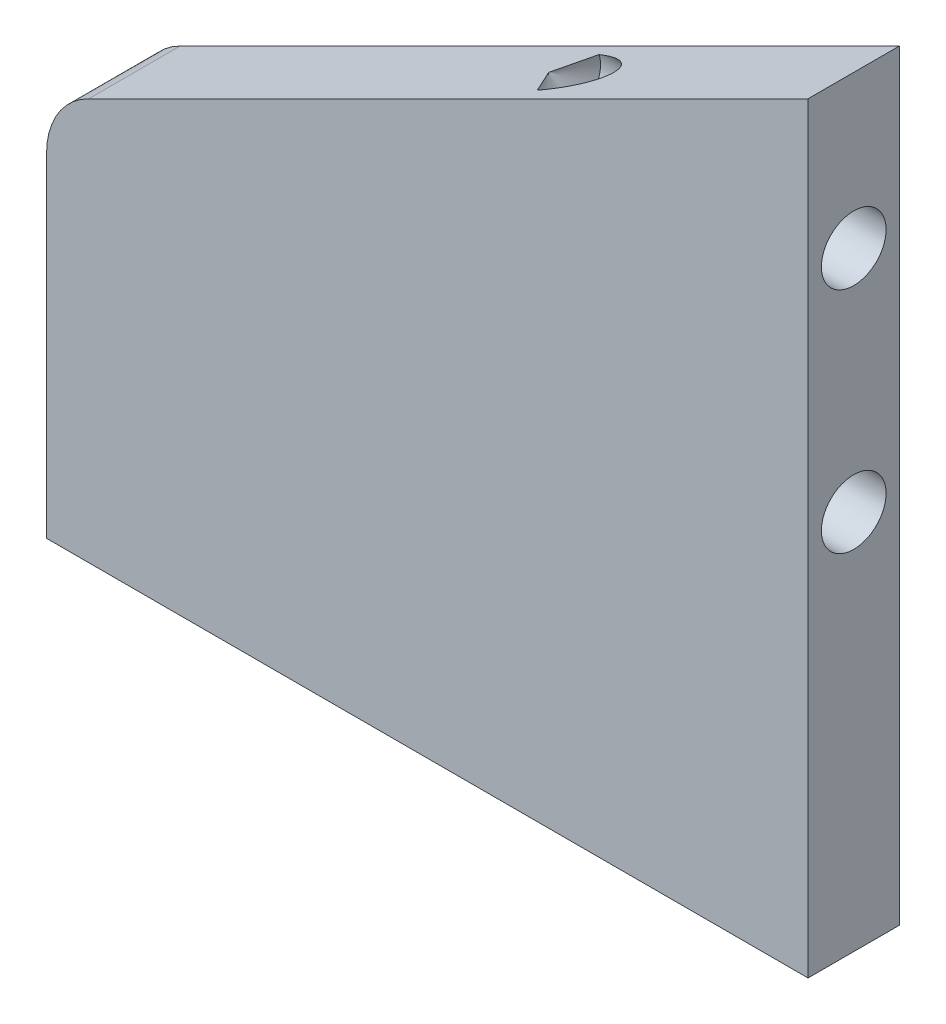
ISO-10303-21;
HEADER;
FILE_DESCRIPTION(('STEP AP214'),'2;1');
FILE_NAME('part.step','',(''),(''),'','','');
FILE_SCHEMA(('AUTOMOTIVE_DESIGN { 1 0 10303 214 1 1 1 1 }'));
ENDSEC;
DATA;
#1=APPLICATION_CONTEXT('core data for automotive mechanical design processes');
#2=APPLICATION_PROTOCOL_DEFINITION('international standard','automotive_design',2000,#1);
#3=PRODUCT_CONTEXT('',#1,'mechanical');
#4=PRODUCT('Part','Part','',(#3));
#5=PRODUCT_RELATED_PRODUCT_CATEGORY('part','',(#4));
#6=PRODUCT_DEFINITION_FORMATION('','',#4);
#7=PRODUCT_DEFINITION_CONTEXT('part definition',#1,'design');
#8=PRODUCT_DEFINITION('design','',#6,#7);
#9=PRODUCT_DEFINITION_SHAPE('','',#8);
#10=(LENGTH_UNIT() NAMED_UNIT(*) SI_UNIT(.MILLI.,.METRE.));
#11=(NAMED_UNIT(*) PLANE_ANGLE_UNIT() SI_UNIT($,.RADIAN.));
#12=(NAMED_UNIT(*) SI_UNIT($,.STERADIAN.) SOLID_ANGLE_UNIT());
#13=UNCERTAINTY_MEASURE_WITH_UNIT(LENGTH_MEASURE(1.E-05),#10,'distance_accuracy_value','');
#14=(GEOMETRIC_REPRESENTATION_CONTEXT(3) GLOBAL_UNCERTAINTY_ASSIGNED_CONTEXT((#13)) GLOBAL_UNIT_ASSIGNED_CONTEXT((#10,
#11,#12)) REPRESENTATION_CONTEXT('',''));
#15=CARTESIAN_POINT('',(0.,0.,0.));
#16=DIRECTION('',(0.,0.,1.));
#17=DIRECTION('',(1.,0.,0.));
#18=AXIS2_PLACEMENT_3D('',#15,#16,#17);
#19=CARTESIAN_POINT('',(0.,0.,12.));
#20=DIRECTION('',(0.,1.,0.));
#21=DIRECTION('',(0.,0.,1.));
#22=AXIS2_PLACEMENT_3D('',#19,#20,#21);
#23=PLANE('',#22);
#24=CARTESIAN_POINT('',(15.,0.,6.));
#25=DIRECTION('',(0.,-1.,0.));
#26=DIRECTION('',(0.,0.,-1.));
#27=AXIS2_PLACEMENT_3D('',#24,#25,#26);
#28=CIRCLE('',#27,4.24999999999999);
#29=CARTESIAN_POINT('',(15.,0.,1.75000000000001));
#30=VERTEX_POINT('',#29);
#31=EDGE_CURVE('E117',#30,#30,#28,.T.);
#32=ORIENTED_EDGE('',*,*,#31,.F.);
#33=EDGE_LOOP('',(#32));
#34=FACE_BOUND('',#33,.T.);
#35=CARTESIAN_POINT('',(85.,0.,6.00000000000001));
#36=DIRECTION('',(0.,-1.,0.));
#37=DIRECTION('',(0.,0.,-1.));
#38=AXIS2_PLACEMENT_3D('',#35,#36,#37);
#39=CIRCLE('',#38,4.24999999999999);
#40=CARTESIAN_POINT('',(85.,0.,1.75000000000002));
#41=VERTEX_POINT('',#40);
#42=EDGE_CURVE('E123',#41,#41,#39,.T.);
#43=ORIENTED_EDGE('',*,*,#42,.F.);
#44=EDGE_LOOP('',(#43));
#45=FACE_BOUND('',#44,.T.);
#46=DIRECTION('',(1.,0.,0.));
#47=VECTOR('',#46,1.);
#48=CARTESIAN_POINT('',(0.,0.,0.));
#49=LINE('',#48,#47);
#50=CARTESIAN_POINT('',(0.,0.,0.));
#51=VERTEX_POINT('',#50);
#52=CARTESIAN_POINT('',(100.,0.,0.));
#53=VERTEX_POINT('',#52);
#54=EDGE_CURVE('E129',#51,#53,#49,.T.);
#55=ORIENTED_EDGE('',*,*,#54,.T.);
#56=DIRECTION('',(0.,0.,-1.));
#57=VECTOR('',#56,1.);
#58=CARTESIAN_POINT('',(100.,0.,12.));
#59=LINE('',#58,#57);
#60=CARTESIAN_POINT('',(100.,0.,12.));
#61=VERTEX_POINT('',#60);
#62=EDGE_CURVE('E153',#61,#53,#59,.T.);
#63=ORIENTED_EDGE('',*,*,#62,.F.);
#64=DIRECTION('',(1.,0.,0.));
#65=VECTOR('',#64,1.);
#66=CARTESIAN_POINT('',(0.,0.,12.));
#67=LINE('',#66,#65);
#68=CARTESIAN_POINT('',(0.,0.,12.));
#69=VERTEX_POINT('',#68);
#70=EDGE_CURVE('E130',#69,#61,#67,.T.);
#71=ORIENTED_EDGE('',*,*,#70,.F.);
#72=DIRECTION('',(0.,0.,-1.));
#73=VECTOR('',#72,1.);
#74=CARTESIAN_POINT('',(0.,0.,12.));
#75=LINE('',#74,#73);
#76=EDGE_CURVE('E140',#69,#51,#75,.T.);
#77=ORIENTED_EDGE('',*,*,#76,.T.);
#78=EDGE_LOOP('',(#55,#63,#71,#77));
#79=FACE_BOUND('',#78,.T.);
#80=ADVANCED_FACE('F37',(#34,#45,#79),#23,.F.);
#81=CARTESIAN_POINT('',(100.,0.,12.));
#82=DIRECTION('',(-1.,0.,0.));
#83=DIRECTION('',(0.,0.,1.));
#84=AXIS2_PLACEMENT_3D('',#81,#82,#83);
#85=PLANE('',#84);
#86=CARTESIAN_POINT('',(100.,50.,6.));
#87=DIRECTION('',(1.,0.,0.));
#88=DIRECTION('',(0.,0.,-1.));
#89=AXIS2_PLACEMENT_3D('',#86,#87,#88);
#90=CIRCLE('',#89,4.24999999999999);
#91=CARTESIAN_POINT('',(100.,50.,1.75000000000001));
#92=VERTEX_POINT('',#91);
#93=EDGE_CURVE('E108',#92,#92,#90,.T.);
#94=ORIENTED_EDGE('',*,*,#93,.F.);
#95=EDGE_LOOP('',(#94));
#96=FACE_BOUND('',#95,.T.);
#97=CARTESIAN_POINT('',(100.,80.,6.));
#98=DIRECTION('',(1.,0.,0.));
#99=DIRECTION('',(0.,0.,-1.));
#100=AXIS2_PLACEMENT_3D('',#97,#98,#99);
#101=CIRCLE('',#100,4.24999999999999);
#102=CARTESIAN_POINT('',(100.,80.,1.75000000000001));
#103=VERTEX_POINT('',#102);
#104=EDGE_CURVE('E107',#103,#103,#101,.T.);
#105=ORIENTED_EDGE('',*,*,#104,.F.);
#106=EDGE_LOOP('',(#105));
#107=FACE_BOUND('',#106,.T.);
#108=DIRECTION('',(0.,1.,0.));
#109=VECTOR('',#108,1.);
#110=CARTESIAN_POINT('',(100.,0.,0.));
#111=LINE('',#110,#109);
#112=CARTESIAN_POINT('',(100.,100.,0.));
#113=VERTEX_POINT('',#112);
#114=EDGE_CURVE('E143',#53,#113,#111,.T.);
#115=ORIENTED_EDGE('',*,*,#114,.T.);
#116=DIRECTION('',(0.,0.,-1.));
#117=VECTOR('',#116,1.);
#118=CARTESIAN_POINT('',(100.,100.,12.));
#119=LINE('',#118,#117);
#120=CARTESIAN_POINT('',(100.,100.,12.));
#121=VERTEX_POINT('',#120);
#122=EDGE_CURVE('E150',#121,#113,#119,.T.);
#123=ORIENTED_EDGE('',*,*,#122,.F.);
#124=DIRECTION('',(0.,1.,0.));
#125=VECTOR('',#124,1.);
#126=CARTESIAN_POINT('',(100.,0.,12.));
#127=LINE('',#126,#125);
#128=EDGE_CURVE('E133',#61,#121,#127,.T.);
#129=ORIENTED_EDGE('',*,*,#128,.F.);
#130=ORIENTED_EDGE('',*,*,#62,.T.);
#131=EDGE_LOOP('',(#115,#123,#129,#130));
#132=FACE_BOUND('',#131,.T.);
#133=ADVANCED_FACE('F205',(#96,#107,#132),#85,.F.);
#134=CARTESIAN_POINT('',(0.,50.,12.));
#135=DIRECTION('',(0.447213595499958,-0.894427190999916,0.));
#136=DIRECTION('',(0.894427190999916,0.447213595499958,0.));
#137=AXIS2_PLACEMENT_3D('',#134,#135,#136);
#138=PLANE('',#137);
#139=CARTESIAN_POINT('',(62.5002,81.2501,10.0623366891375));
#140=CARTESIAN_POINT('',(62.2664080825014,81.1332040412507,9.69121549689149));
#141=CARTESIAN_POINT('',(62.0326218391265,81.0163109195633,9.32008988759531));
#142=CARTESIAN_POINT('',(61.5650486426673,80.7825243213337,8.57782267600759));
#143=CARTESIAN_POINT('',(61.3312616897696,80.6656308448848,8.2066810735691));
#144=CARTESIAN_POINT('',(60.8867234202351,80.4433617101176,7.50096467448534));
#145=CARTESIAN_POINT('',(60.6759719938853,80.3379859969427,7.16638997375082));
#146=CARTESIAN_POINT('',(60.4178051486172,80.2089025743086,6.75632732516947));
#147=CARTESIAN_POINT('',(60.370319718307,80.1851598591535,6.68089433307122));
#148=CARTESIAN_POINT('',(60.2753683240995,80.1376841620498,6.53001520236507));
#149=CARTESIAN_POINT('',(60.227902359821,80.1139511799105,6.4545690640603));
#150=CARTESIAN_POINT('',(60.1590911287261,80.0795455643631,6.34502870091383));
#151=CARTESIAN_POINT('',(60.1377073231123,80.0688536615561,6.31096453193241));
#152=CARTESIAN_POINT('',(60.0949782603065,80.0474891301532,6.24280243715712));
#153=CARTESIAN_POINT('',(60.0736330053671,80.0368165026836,6.20870450956011));
#154=CARTESIAN_POINT('',(60.0427622305234,80.0213811152617,6.15905324613409));
#155=CARTESIAN_POINT('',(60.0331588372125,80.0165794186063,6.14355977436314));
#156=CARTESIAN_POINT('',(60.0140381823495,80.0070190911748,6.11250675033013));
#157=CARTESIAN_POINT('',(60.0045209107047,80.0022604553524,6.09694720613361));
#158=CARTESIAN_POINT('',(59.9908829996774,79.9954414998387,6.07401981468971));
#159=CARTESIAN_POINT('',(59.9866188545898,79.9933094272949,6.06675756735595));
#160=CARTESIAN_POINT('',(59.978262478285,79.9891312391425,6.05210776839275));
#161=CARTESIAN_POINT('',(59.9741701683383,79.9870850841692,6.04472027637331));
#162=CARTESIAN_POINT('',(59.9687143594561,79.9843571797281,6.03384193220145));
#163=CARTESIAN_POINT('',(59.9671131643999,79.9835565821999,6.03050238024678));
#164=CARTESIAN_POINT('',(59.9641320132306,79.9820660066153,6.02368866628786));
#165=CARTESIAN_POINT('',(59.9627523804271,79.9813761902136,6.02021431659247));
#166=CARTESIAN_POINT('',(59.9608081009552,79.9804040504776,6.01414687820735));
#167=CARTESIAN_POINT('',(59.9601231564563,79.9800615782282,6.01160452009969));
#168=CARTESIAN_POINT('',(59.9591325796105,79.9795662898053,6.00644096988909));
#169=CARTESIAN_POINT('',(59.9588240489258,79.9794120244629,6.0038205413885));
#170=CARTESIAN_POINT('',(59.9586842663287,79.9793421331643,5.99854055589717));
#171=CARTESIAN_POINT('',(59.9588569145362,79.9794284572681,5.99588085399007));
#172=CARTESIAN_POINT('',(59.959625188983,79.9798125944915,5.99062689440705));
#173=CARTESIAN_POINT('',(59.9602240058003,79.9801120029001,5.98803328418772));
#174=CARTESIAN_POINT('',(59.9620450812027,79.9810225406013,5.9817171442175));
#175=CARTESIAN_POINT('',(59.9634288404009,79.9817144202004,5.97805678276755));
#176=CARTESIAN_POINT('',(59.9664712519059,79.9832356259529,5.97087795932769));
#177=CARTESIAN_POINT('',(59.9681308285447,79.9840654142724,5.96736002568765));
#178=CARTESIAN_POINT('',(59.9733316209127,79.9866658104563,5.95688599259118));
#179=CARTESIAN_POINT('',(59.9770756390202,79.9885378195101,5.95005775292166));
#180=CARTESIAN_POINT('',(59.9884090652394,79.9942045326197,5.9299864214156));
#181=CARTESIAN_POINT('',(59.9962235791391,79.9981117895696,5.91690996867429));
#182=CARTESIAN_POINT('',(60.011997315775,80.0059986578875,5.890849528855));
#183=CARTESIAN_POINT('',(60.0199566638611,80.0099783319306,5.87786563687063));
#184=CARTESIAN_POINT('',(60.0358845090846,80.0179422545423,5.85203573524907));
#185=CARTESIAN_POINT('',(60.0438525723639,80.021926286182,5.83918938958497));
#186=CARTESIAN_POINT('',(60.0598148554472,80.0299074277236,5.81352331252119));
#187=CARTESIAN_POINT('',(60.0678090657617,80.0339045328809,5.80070357374343));
#188=CARTESIAN_POINT('',(60.1078583674271,80.0539291837136,5.73656401218132));
#189=CARTESIAN_POINT('',(60.1400200760617,80.0700100380309,5.6853275167782));
#190=CARTESIAN_POINT('',(60.2043824287728,80.1021912143864,5.58287549778534));
#191=CARTESIAN_POINT('',(60.2365830772929,80.1182915386464,5.53165997770467));
#192=CARTESIAN_POINT('',(60.3010898065717,80.1505449032858,5.42910878535223));
#193=CARTESIAN_POINT('',(60.3333959404266,80.1666979702133,5.37777315473269));
#194=CARTESIAN_POINT('',(60.3980145291736,80.1990072645868,5.27510993160965));
#195=CARTESIAN_POINT('',(60.4303269837629,80.2151634918815,5.22378233886759));
#196=CARTESIAN_POINT('',(60.5917889255152,80.2958944627576,4.96732702987896));
#197=CARTESIAN_POINT('',(60.7209677839552,80.3604838919776,4.76222242144738));
#198=CARTESIAN_POINT('',(60.9793361754226,80.4896680877113,4.35201712596012));
#199=CARTESIAN_POINT('',(61.1085257085786,80.5542628542893,4.14691643900578));
#200=CARTESIAN_POINT('',(61.4958487853938,80.7479243926969,3.53202121584981));
#201=CARTESIAN_POINT('',(61.7539894937478,80.8769947468739,3.12223231878181));
#202=CARTESIAN_POINT('',(62.0934582092544,81.0467291046272,2.58334201502524));
#203=CARTESIAN_POINT('',(62.1747851154878,81.0873925577439,2.45423974032742));
#204=CARTESIAN_POINT('',(62.3374746082567,81.1687373041283,2.19597935668507));
#205=CARTESIAN_POINT('',(62.4188371949397,81.2094185974698,2.06682124785673));
#206=CARTESIAN_POINT('',(62.5001999999999,81.2500999999999,1.93766331086234));
#207=B_SPLINE_CURVE_WITH_KNOTS('',3,(#139,#140,#141,#142,#143,#144,#145,#146,#147,#148,#149,
#150,#151,#152,#153,#154,#155,#156,#157,#158,#159,#160,#161,#162,#163,#164,#165,#166,#167,#168,
#169,#170,#171,#172,#173,#174,#175,#176,#177,#178,#179,#180,#181,#182,#183,#184,#185,#186,#187,
#188,#189,#190,#191,#192,#193,#194,#195,#196,#197,#198,#199,#200,#201,#202,#203,#204,#205,#206),
.UNSPECIFIED.,.F.,.F.,(4,2,2,2,2,2,2,2,2,2,2,2,2,2,2,2,2,2,2,2,2,2,2,2,2,2,2,2,2,2,2,2,2,4),(0.,
1.36179593167269,2.72363246086893,3.95129018278086,4.22801840410507,4.50474091985916,
4.62959138177295,4.75444891712395,4.81100040323864,4.86754517385878,4.89360868798789,
4.91966012734365,4.93102399779125,4.94240430291706,4.95034778566156,4.95822971054675,
4.96617570650131,4.97418182581703,4.98606867379352,4.99799619192718,5.02200863697931,
5.06918721071211,5.11640876614579,5.16330776816748,5.21019130815525,5.39797632581356,
5.58578529851968,5.77409245435109,5.96239211777047,6.71494897678712,7.4675168513189,
8.9711805388076,9.44490494704094,9.91883521304791),.UNSPECIFIED.);
#208=CARTESIAN_POINT('',(62.5,81.25,10.062019202318));
#209=VERTEX_POINT('',#208);
#210=CARTESIAN_POINT('',(62.5,81.25,1.93798079768203));
#211=VERTEX_POINT('',#210);
#212=EDGE_CURVE('E156',#209,#211,#207,.T.);
#213=ORIENTED_EDGE('',*,*,#212,.T.);
#214=CARTESIAN_POINT('',(60.,80.,6.));
#215=DIRECTION('',(0.447213595499958,-0.894427190999916,0.));
#216=DIRECTION('',(0.894427190999916,0.447213595499958,0.));
#217=AXIS2_PLACEMENT_3D('',#214,#215,#216);
#218=ELLIPSE('',#217,9.50328890437408,4.24999999999999);
#219=EDGE_CURVE('E165',#211,#209,#218,.T.);
#220=ORIENTED_EDGE('',*,*,#219,.T.);
#221=EDGE_LOOP('',(#213,#220));
#222=FACE_BOUND('',#221,.T.);
#223=DIRECTION('',(-0.894427190999916,-0.447213595499958,0.));
#224=VECTOR('',#223,1.);
#225=CARTESIAN_POINT('',(0.,50.,0.));
#226=LINE('',#225,#224);
#227=CARTESIAN_POINT('',(5.52786404500042,52.7639320225002,0.));
#228=VERTEX_POINT('',#227);
#229=EDGE_CURVE('E145',#113,#228,#226,.T.);
#230=ORIENTED_EDGE('',*,*,#229,.T.);
#231=DIRECTION('',(0.,0.,-1.));
#232=VECTOR('',#231,1.);
#233=CARTESIAN_POINT('',(5.52786404500042,52.7639320225002,12.));
#234=LINE('',#233,#232);
#235=CARTESIAN_POINT('',(5.52786404500042,52.7639320225002,12.));
#236=VERTEX_POINT('',#235);
#237=EDGE_CURVE('E45',#228,#236,#234,.F.);
#238=ORIENTED_EDGE('',*,*,#237,.T.);
#239=DIRECTION('',(-0.894427190999916,-0.447213595499958,0.));
#240=VECTOR('',#239,1.);
#241=CARTESIAN_POINT('',(0.,50.,12.));
#242=LINE('',#241,#240);
#243=EDGE_CURVE('E136',#121,#236,#242,.T.);
#244=ORIENTED_EDGE('',*,*,#243,.F.);
#245=ORIENTED_EDGE('',*,*,#122,.T.);
#246=EDGE_LOOP('',(#230,#238,#244,#245));
#247=FACE_BOUND('',#246,.T.);
#248=ADVANCED_FACE('F167',(#222,#247),#138,.F.);
#249=CARTESIAN_POINT('',(0.,0.,12.));
#250=DIRECTION('',(1.,0.,0.));
#251=DIRECTION('',(0.,0.,-1.));
#252=AXIS2_PLACEMENT_3D('',#249,#250,#251);
#253=PLANE('',#252);
#254=DIRECTION('',(0.,-1.,0.));
#255=VECTOR('',#254,1.);
#256=CARTESIAN_POINT('',(0.,0.,12.));
#257=LINE('',#256,#255);
#258=CARTESIAN_POINT('',(0.,43.8196601125011,12.));
#259=VERTEX_POINT('',#258);
#260=EDGE_CURVE('E138',#259,#69,#257,.T.);
#261=ORIENTED_EDGE('',*,*,#260,.F.);
#262=DIRECTION('',(0.,0.,-1.));
#263=VECTOR('',#262,1.);
#264=CARTESIAN_POINT('',(0.,43.8196601125011,12.));
#265=LINE('',#264,#263);
#266=CARTESIAN_POINT('',(0.,43.8196601125011,0.));
#267=VERTEX_POINT('',#266);
#268=EDGE_CURVE('E227',#259,#267,#265,.T.);
#269=ORIENTED_EDGE('',*,*,#268,.T.);
#270=DIRECTION('',(0.,-1.,0.));
#271=VECTOR('',#270,1.);
#272=CARTESIAN_POINT('',(0.,0.,0.));
#273=LINE('',#272,#271);
#274=EDGE_CURVE('E134',#267,#51,#273,.T.);
#275=ORIENTED_EDGE('',*,*,#274,.T.);
#276=ORIENTED_EDGE('',*,*,#76,.F.);
#277=EDGE_LOOP('',(#261,#269,#275,#276));
#278=FACE_BOUND('',#277,.T.);
#279=ADVANCED_FACE('F197',(#278),#253,.F.);
#280=CARTESIAN_POINT('',(0.,0.,12.));
#281=DIRECTION('',(0.,0.,1.));
#282=DIRECTION('',(1.,0.,0.));
#283=AXIS2_PLACEMENT_3D('',#280,#281,#282);
#284=PLANE('',#283);
#285=ORIENTED_EDGE('',*,*,#243,.T.);
#286=CARTESIAN_POINT('',(10.,43.8196601125011,12.));
#287=DIRECTION('',(0.,0.,1.));
#288=DIRECTION('',(1.,0.,0.));
#289=AXIS2_PLACEMENT_3D('',#286,#287,#288);
#290=CIRCLE('',#289,10.);
#291=EDGE_CURVE('E11',#236,#259,#290,.T.);
#292=ORIENTED_EDGE('',*,*,#291,.T.);
#293=ORIENTED_EDGE('',*,*,#260,.T.);
#294=ORIENTED_EDGE('',*,*,#70,.T.);
#295=ORIENTED_EDGE('',*,*,#128,.T.);
#296=EDGE_LOOP('',(#285,#292,#293,#294,#295));
#297=FACE_BOUND('',#296,.T.);
#298=ADVANCED_FACE('F194',(#297),#284,.T.);
#299=CARTESIAN_POINT('',(0.,0.,0.));
#300=DIRECTION('',(0.,0.,1.));
#301=DIRECTION('',(1.,0.,0.));
#302=AXIS2_PLACEMENT_3D('',#299,#300,#301);
#303=PLANE('',#302);
#304=ORIENTED_EDGE('',*,*,#274,.F.);
#305=CARTESIAN_POINT('',(10.,43.8196601125011,0.));
#306=DIRECTION('',(0.,0.,1.));
#307=DIRECTION('',(1.,0.,0.));
#308=AXIS2_PLACEMENT_3D('',#305,#306,#307);
#309=CIRCLE('',#308,10.);
#310=EDGE_CURVE('E59',#267,#228,#309,.F.);
#311=ORIENTED_EDGE('',*,*,#310,.T.);
#312=ORIENTED_EDGE('',*,*,#229,.F.);
#313=ORIENTED_EDGE('',*,*,#114,.F.);
#314=ORIENTED_EDGE('',*,*,#54,.F.);
#315=EDGE_LOOP('',(#304,#311,#312,#313,#314));
#316=FACE_BOUND('',#315,.T.);
#317=ADVANCED_FACE('F192',(#316),#303,.F.);
#318=CARTESIAN_POINT('',(85.,37.5,6.00000000000001));
#319=DIRECTION('',(0.,-1.,0.));
#320=DIRECTION('',(0.,0.,-1.));
#321=AXIS2_PLACEMENT_3D('',#318,#319,#320);
#322=CONICAL_SURFACE('',#321,4.24999999999999,1.02974425867665);
#323=CARTESIAN_POINT('',(85.,40.0536576308671,6.00000000000001));
#324=VERTEX_POINT('',#323);
#325=VERTEX_LOOP('',#324);
#326=FACE_BOUND('',#325,.T.);
#327=CARTESIAN_POINT('',(85.,37.5,6.00000000000001));
#328=DIRECTION('',(0.,-1.,0.));
#329=DIRECTION('',(0.,0.,-1.));
#330=AXIS2_PLACEMENT_3D('',#327,#328,#329);
#331=CIRCLE('',#330,4.24999999999999);
#332=CARTESIAN_POINT('',(85.,37.5,1.75000000000002));
#333=VERTEX_POINT('',#332);
#334=EDGE_CURVE('E126',#333,#333,#331,.T.);
#335=ORIENTED_EDGE('',*,*,#334,.T.);
#336=EDGE_LOOP('',(#335));
#337=FACE_BOUND('',#336,.T.);
#338=ADVANCED_FACE('F188',(#326,#337),#322,.F.);
#339=CARTESIAN_POINT('',(85.,0.,6.00000000000001));
#340=DIRECTION('',(0.,-1.,0.));
#341=DIRECTION('',(0.,0.,-1.));
#342=AXIS2_PLACEMENT_3D('',#339,#340,#341);
#343=CYLINDRICAL_SURFACE('',#342,4.24999999999999);
#344=ORIENTED_EDGE('',*,*,#334,.F.);
#345=EDGE_LOOP('',(#344));
#346=FACE_BOUND('',#345,.T.);
#347=ORIENTED_EDGE('',*,*,#42,.T.);
#348=EDGE_LOOP('',(#347));
#349=FACE_BOUND('',#348,.T.);
#350=ADVANCED_FACE('F184',(#346,#349),#343,.F.);
#351=CARTESIAN_POINT('',(15.,37.5,6.));
#352=DIRECTION('',(0.,-1.,0.));
#353=DIRECTION('',(0.,0.,-1.));
#354=AXIS2_PLACEMENT_3D('',#351,#352,#353);
#355=CONICAL_SURFACE('',#354,4.24999999999999,1.02974425867665);
#356=CARTESIAN_POINT('',(15.,40.0536576308671,6.));
#357=VERTEX_POINT('',#356);
#358=VERTEX_LOOP('',#357);
#359=FACE_BOUND('',#358,.T.);
#360=CARTESIAN_POINT('',(15.,37.5,6.));
#361=DIRECTION('',(0.,-1.,0.));
#362=DIRECTION('',(0.,0.,-1.));
#363=AXIS2_PLACEMENT_3D('',#360,#361,#362);
#364=CIRCLE('',#363,4.24999999999999);
#365=CARTESIAN_POINT('',(15.,37.5,1.75000000000001));
#366=VERTEX_POINT('',#365);
#367=EDGE_CURVE('E120',#366,#366,#364,.T.);
#368=ORIENTED_EDGE('',*,*,#367,.T.);
#369=EDGE_LOOP('',(#368));
#370=FACE_BOUND('',#369,.T.);
#371=ADVANCED_FACE('F180',(#359,#370),#355,.F.);
#372=CARTESIAN_POINT('',(15.,0.,6.));
#373=DIRECTION('',(0.,-1.,0.));
#374=DIRECTION('',(0.,0.,-1.));
#375=AXIS2_PLACEMENT_3D('',#372,#373,#374);
#376=CYLINDRICAL_SURFACE('',#375,4.24999999999999);
#377=ORIENTED_EDGE('',*,*,#367,.F.);
#378=EDGE_LOOP('',(#377));
#379=FACE_BOUND('',#378,.T.);
#380=ORIENTED_EDGE('',*,*,#31,.T.);
#381=EDGE_LOOP('',(#380));
#382=FACE_BOUND('',#381,.T.);
#383=ADVANCED_FACE('F177',(#379,#382),#376,.F.);
#384=CARTESIAN_POINT('',(100.,80.,6.));
#385=DIRECTION('',(1.,0.,0.));
#386=DIRECTION('',(0.,0.,-1.));
#387=AXIS2_PLACEMENT_3D('',#384,#385,#386);
#388=CYLINDRICAL_SURFACE('',#387,4.24999999999999);
#389=ORIENTED_EDGE('',*,*,#104,.T.);
#390=EDGE_LOOP('',(#389));
#391=FACE_BOUND('',#390,.T.);
#392=CARTESIAN_POINT('',(62.5,80.,6.));
#393=DIRECTION('',(1.,0.,0.));
#394=DIRECTION('',(0.,0.,-1.));
#395=AXIS2_PLACEMENT_3D('',#392,#393,#394);
#396=CIRCLE('',#395,4.24999999999999);
#397=EDGE_CURVE('E111',#209,#211,#396,.T.);
#398=ORIENTED_EDGE('',*,*,#397,.F.);
#399=ORIENTED_EDGE('',*,*,#219,.F.);
#400=EDGE_LOOP('',(#398,#399));
#401=FACE_BOUND('',#400,.T.);
#402=ADVANCED_FACE('F175',(#391,#401),#388,.F.);
#403=CARTESIAN_POINT('',(62.5,80.,6.));
#404=DIRECTION('',(1.,0.,0.));
#405=DIRECTION('',(0.,0.,-1.));
#406=AXIS2_PLACEMENT_3D('',#403,#404,#405);
#407=CONICAL_SURFACE('',#406,4.24999999999999,1.02974425867665);
#408=ORIENTED_EDGE('',*,*,#397,.T.);
#409=ORIENTED_EDGE('',*,*,#212,.F.);
#410=EDGE_LOOP('',(#408,#409));
#411=FACE_BOUND('',#410,.T.);
#412=ADVANCED_FACE('F101',(#411),#407,.F.);
#413=CARTESIAN_POINT('',(62.5,50.,6.));
#414=DIRECTION('',(1.,0.,0.));
#415=DIRECTION('',(0.,0.,-1.));
#416=AXIS2_PLACEMENT_3D('',#413,#414,#415);
#417=CONICAL_SURFACE('',#416,4.24999999999998,1.02974425867665);
#418=CARTESIAN_POINT('',(59.9463423691329,50.,6.));
#419=VERTEX_POINT('',#418);
#420=VERTEX_LOOP('',#419);
#421=FACE_BOUND('',#420,.T.);
#422=CARTESIAN_POINT('',(62.5,50.,6.));
#423=DIRECTION('',(1.,0.,0.));
#424=DIRECTION('',(0.,0.,-1.));
#425=AXIS2_PLACEMENT_3D('',#422,#423,#424);
#426=CIRCLE('',#425,4.24999999999998);
#427=CARTESIAN_POINT('',(62.5,50.,1.75000000000002));
#428=VERTEX_POINT('',#427);
#429=EDGE_CURVE('E105',#428,#428,#426,.T.);
#430=ORIENTED_EDGE('',*,*,#429,.T.);
#431=EDGE_LOOP('',(#430));
#432=FACE_BOUND('',#431,.T.);
#433=ADVANCED_FACE('F97',(#421,#432),#417,.F.);
#434=CARTESIAN_POINT('',(100.,50.,6.));
#435=DIRECTION('',(1.,0.,0.));
#436=DIRECTION('',(0.,0.,-1.));
#437=AXIS2_PLACEMENT_3D('',#434,#435,#436);
#438=CYLINDRICAL_SURFACE('',#437,4.24999999999999);
#439=ORIENTED_EDGE('',*,*,#429,.F.);
#440=EDGE_LOOP('',(#439));
#441=FACE_BOUND('',#440,.T.);
#442=ORIENTED_EDGE('',*,*,#93,.T.);
#443=EDGE_LOOP('',(#442));
#444=FACE_BOUND('',#443,.T.);
#445=ADVANCED_FACE('F100',(#441,#444),#438,.F.);
#446=CARTESIAN_POINT('',(10.,43.8196601125011,12.));
#447=DIRECTION('',(0.,0.,-1.));
#448=DIRECTION('',(-1.,0.,0.));
#449=AXIS2_PLACEMENT_3D('',#446,#447,#448);
#450=CYLINDRICAL_SURFACE('',#449,10.);
#451=ORIENTED_EDGE('',*,*,#291,.F.);
#452=ORIENTED_EDGE('',*,*,#237,.F.);
#453=ORIENTED_EDGE('',*,*,#310,.F.);
#454=ORIENTED_EDGE('',*,*,#268,.F.);
#455=EDGE_LOOP('',(#451,#452,#453,#454));
#456=FACE_BOUND('',#455,.T.);
#457=ADVANCED_FACE('F39',(#456),#450,.T.);
#458=CLOSED_SHELL('',(#80,#133,#248,#279,#298,#317,#338,#350,#371,#383,#402,#412,#433,#445,#457));
#459=MANIFOLD_SOLID_BREP('B2',#458);
#460=ADVANCED_BREP_SHAPE_REPRESENTATION('',(#18,#459),#14);
#461=SHAPE_DEFINITION_REPRESENTATION(#9,#460);
ENDSEC;
END-ISO-10303-21;
